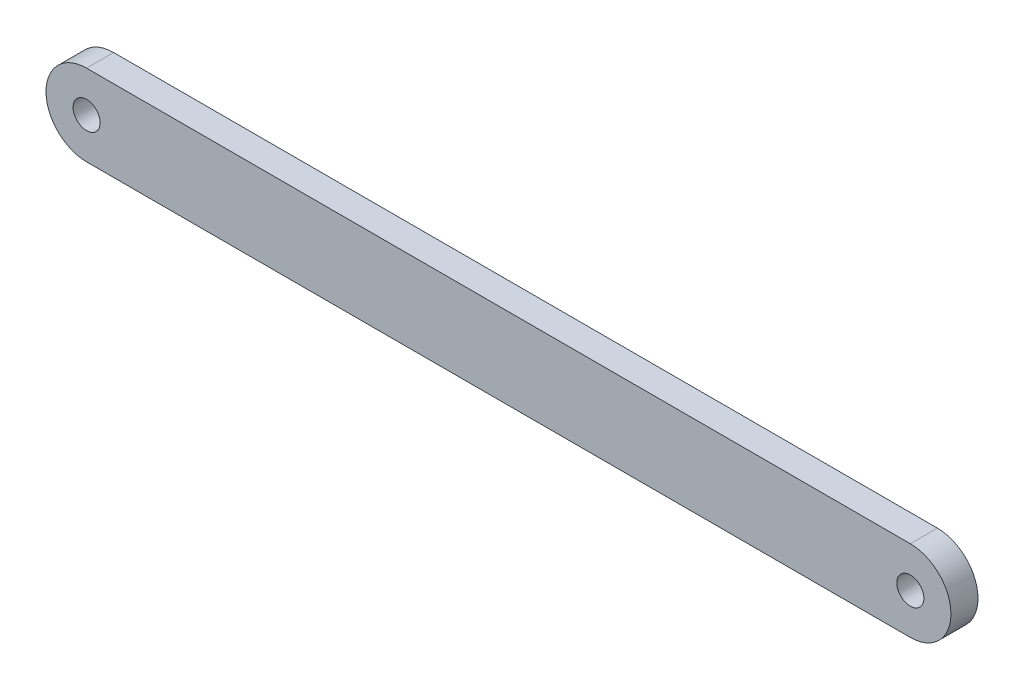
ISO-10303-21;
HEADER;
FILE_DESCRIPTION(('STEP AP214'),'2;1');
FILE_NAME('part.step','',(''),(''),'','','');
FILE_SCHEMA(('AUTOMOTIVE_DESIGN { 1 0 10303 214 1 1 1 1 }'));
ENDSEC;
DATA;
#1=APPLICATION_CONTEXT('core data for automotive mechanical design processes');
#2=APPLICATION_PROTOCOL_DEFINITION('international standard','automotive_design',2000,#1);
#3=PRODUCT_CONTEXT('',#1,'mechanical');
#4=PRODUCT('Part','Part','',(#3));
#5=PRODUCT_RELATED_PRODUCT_CATEGORY('part','',(#4));
#6=PRODUCT_DEFINITION_FORMATION('','',#4);
#7=PRODUCT_DEFINITION_CONTEXT('part definition',#1,'design');
#8=PRODUCT_DEFINITION('design','',#6,#7);
#9=PRODUCT_DEFINITION_SHAPE('','',#8);
#10=(LENGTH_UNIT() NAMED_UNIT(*) SI_UNIT(.MILLI.,.METRE.));
#11=(NAMED_UNIT(*) PLANE_ANGLE_UNIT() SI_UNIT($,.RADIAN.));
#12=(NAMED_UNIT(*) SI_UNIT($,.STERADIAN.) SOLID_ANGLE_UNIT());
#13=UNCERTAINTY_MEASURE_WITH_UNIT(LENGTH_MEASURE(1.E-05),#10,'distance_accuracy_value','');
#14=(GEOMETRIC_REPRESENTATION_CONTEXT(3) GLOBAL_UNCERTAINTY_ASSIGNED_CONTEXT((#13)) GLOBAL_UNIT_ASSIGNED_CONTEXT((#10,
#11,#12)) REPRESENTATION_CONTEXT('',''));
#15=CARTESIAN_POINT('',(0.,0.,0.));
#16=DIRECTION('',(0.,0.,1.));
#17=DIRECTION('',(1.,0.,0.));
#18=AXIS2_PLACEMENT_3D('',#15,#16,#17);
#19=CARTESIAN_POINT('',(0.,0.,5.));
#20=DIRECTION('',(0.,0.,1.));
#21=DIRECTION('',(1.,0.,0.));
#22=AXIS2_PLACEMENT_3D('',#19,#20,#21);
#23=PLANE('',#22);
#24=CARTESIAN_POINT('',(0.,0.,5.));
#25=DIRECTION('',(0.,0.,1.));
#26=DIRECTION('',(1.,0.,0.));
#27=AXIS2_PLACEMENT_3D('',#24,#25,#26);
#28=CIRCLE('',#27,2.5);
#29=CARTESIAN_POINT('',(2.50000000000002,0.,5.));
#30=VERTEX_POINT('',#29);
#31=EDGE_CURVE('E103',#30,#30,#28,.T.);
#32=ORIENTED_EDGE('',*,*,#31,.F.);
#33=EDGE_LOOP('',(#32));
#34=FACE_BOUND('',#33,.T.);
#35=CARTESIAN_POINT('',(0.,0.,5.));
#36=DIRECTION('',(0.,0.,1.));
#37=DIRECTION('',(1.,0.,0.));
#38=AXIS2_PLACEMENT_3D('',#35,#36,#37);
#39=CIRCLE('',#38,7.5);
#40=CARTESIAN_POINT('',(0.,7.5,5.));
#41=VERTEX_POINT('',#40);
#42=CARTESIAN_POINT('',(0.,-7.5,5.));
#43=VERTEX_POINT('',#42);
#44=EDGE_CURVE('E88',#41,#43,#39,.T.);
#45=ORIENTED_EDGE('',*,*,#44,.T.);
#46=DIRECTION('',(1.,0.,0.));
#47=VECTOR('',#46,1.);
#48=CARTESIAN_POINT('',(0.,-7.5,5.));
#49=LINE('',#48,#47);
#50=CARTESIAN_POINT('',(152.204,-7.5,5.));
#51=VERTEX_POINT('',#50);
#52=EDGE_CURVE('E83',#43,#51,#49,.T.);
#53=ORIENTED_EDGE('',*,*,#52,.T.);
#54=CARTESIAN_POINT('',(152.204,0.,5.));
#55=DIRECTION('',(0.,0.,1.));
#56=DIRECTION('',(1.,0.,0.));
#57=AXIS2_PLACEMENT_3D('',#54,#55,#56);
#58=CIRCLE('',#57,7.5);
#59=CARTESIAN_POINT('',(152.204,7.5,5.));
#60=VERTEX_POINT('',#59);
#61=EDGE_CURVE('E86',#51,#60,#58,.T.);
#62=ORIENTED_EDGE('',*,*,#61,.T.);
#63=DIRECTION('',(-1.,0.,0.));
#64=VECTOR('',#63,1.);
#65=CARTESIAN_POINT('',(0.,7.5,5.));
#66=LINE('',#65,#64);
#67=EDGE_CURVE('E53',#60,#41,#66,.T.);
#68=ORIENTED_EDGE('',*,*,#67,.T.);
#69=EDGE_LOOP('',(#45,#53,#62,#68));
#70=FACE_BOUND('',#69,.T.);
#71=CARTESIAN_POINT('',(152.204,0.,5.));
#72=DIRECTION('',(0.,0.,1.));
#73=DIRECTION('',(1.,0.,0.));
#74=AXIS2_PLACEMENT_3D('',#71,#72,#73);
#75=CIRCLE('',#74,2.5);
#76=CARTESIAN_POINT('',(154.704,0.,5.));
#77=VERTEX_POINT('',#76);
#78=EDGE_CURVE('E118',#77,#77,#75,.T.);
#79=ORIENTED_EDGE('',*,*,#78,.F.);
#80=EDGE_LOOP('',(#79));
#81=FACE_BOUND('',#80,.T.);
#82=ADVANCED_FACE('F36',(#34,#70,#81),#23,.T.);
#83=CARTESIAN_POINT('',(0.,0.,0.));
#84=DIRECTION('',(0.,0.,1.));
#85=DIRECTION('',(1.,0.,0.));
#86=AXIS2_PLACEMENT_3D('',#83,#84,#85);
#87=PLANE('',#86);
#88=CARTESIAN_POINT('',(0.,0.,0.));
#89=DIRECTION('',(0.,0.,1.));
#90=DIRECTION('',(1.,0.,0.));
#91=AXIS2_PLACEMENT_3D('',#88,#89,#90);
#92=CIRCLE('',#91,7.5);
#93=CARTESIAN_POINT('',(0.,7.5,0.));
#94=VERTEX_POINT('',#93);
#95=CARTESIAN_POINT('',(0.,-7.5,0.));
#96=VERTEX_POINT('',#95);
#97=EDGE_CURVE('E100',#94,#96,#92,.T.);
#98=ORIENTED_EDGE('',*,*,#97,.F.);
#99=DIRECTION('',(-1.,0.,0.));
#100=VECTOR('',#99,1.);
#101=CARTESIAN_POINT('',(0.,7.5,0.));
#102=LINE('',#101,#100);
#103=CARTESIAN_POINT('',(152.204,7.5,0.));
#104=VERTEX_POINT('',#103);
#105=EDGE_CURVE('E76',#104,#94,#102,.T.);
#106=ORIENTED_EDGE('',*,*,#105,.F.);
#107=CARTESIAN_POINT('',(152.204,0.,0.));
#108=DIRECTION('',(0.,0.,1.));
#109=DIRECTION('',(1.,0.,0.));
#110=AXIS2_PLACEMENT_3D('',#107,#108,#109);
#111=CIRCLE('',#110,7.5);
#112=CARTESIAN_POINT('',(152.204,-7.5,0.));
#113=VERTEX_POINT('',#112);
#114=EDGE_CURVE('E70',#113,#104,#111,.T.);
#115=ORIENTED_EDGE('',*,*,#114,.F.);
#116=DIRECTION('',(1.,0.,0.));
#117=VECTOR('',#116,1.);
#118=CARTESIAN_POINT('',(0.,-7.5,0.));
#119=LINE('',#118,#117);
#120=EDGE_CURVE('E92',#96,#113,#119,.T.);
#121=ORIENTED_EDGE('',*,*,#120,.F.);
#122=EDGE_LOOP('',(#98,#106,#115,#121));
#123=FACE_BOUND('',#122,.T.);
#124=CARTESIAN_POINT('',(0.,0.,0.));
#125=DIRECTION('',(0.,0.,1.));
#126=DIRECTION('',(1.,0.,0.));
#127=AXIS2_PLACEMENT_3D('',#124,#125,#126);
#128=CIRCLE('',#127,2.5);
#129=CARTESIAN_POINT('',(2.50000000000002,0.,0.));
#130=VERTEX_POINT('',#129);
#131=EDGE_CURVE('E115',#130,#130,#128,.T.);
#132=ORIENTED_EDGE('',*,*,#131,.T.);
#133=EDGE_LOOP('',(#132));
#134=FACE_BOUND('',#133,.T.);
#135=CARTESIAN_POINT('',(152.204,0.,0.));
#136=DIRECTION('',(0.,0.,1.));
#137=DIRECTION('',(1.,0.,0.));
#138=AXIS2_PLACEMENT_3D('',#135,#136,#137);
#139=CIRCLE('',#138,2.5);
#140=CARTESIAN_POINT('',(154.704,0.,0.));
#141=VERTEX_POINT('',#140);
#142=EDGE_CURVE('E121',#141,#141,#139,.T.);
#143=ORIENTED_EDGE('',*,*,#142,.T.);
#144=EDGE_LOOP('',(#143));
#145=FACE_BOUND('',#144,.T.);
#146=ADVANCED_FACE('F111',(#123,#134,#145),#87,.F.);
#147=CARTESIAN_POINT('',(0.,0.,5.));
#148=DIRECTION('',(0.,0.,-1.));
#149=DIRECTION('',(-1.,0.,0.));
#150=AXIS2_PLACEMENT_3D('',#147,#148,#149);
#151=CYLINDRICAL_SURFACE('',#150,7.5);
#152=ORIENTED_EDGE('',*,*,#97,.T.);
#153=DIRECTION('',(0.,0.,-1.));
#154=VECTOR('',#153,1.);
#155=CARTESIAN_POINT('',(0.,-7.5,5.));
#156=LINE('',#155,#154);
#157=EDGE_CURVE('E11',#43,#96,#156,.T.);
#158=ORIENTED_EDGE('',*,*,#157,.F.);
#159=ORIENTED_EDGE('',*,*,#44,.F.);
#160=DIRECTION('',(0.,0.,-1.));
#161=VECTOR('',#160,1.);
#162=CARTESIAN_POINT('',(0.,7.5,5.));
#163=LINE('',#162,#161);
#164=EDGE_CURVE('E96',#41,#94,#163,.T.);
#165=ORIENTED_EDGE('',*,*,#164,.T.);
#166=EDGE_LOOP('',(#152,#158,#159,#165));
#167=FACE_BOUND('',#166,.T.);
#168=ADVANCED_FACE('F38',(#167),#151,.T.);
#169=CARTESIAN_POINT('',(0.,-7.5,5.));
#170=DIRECTION('',(0.,1.,0.));
#171=DIRECTION('',(0.,0.,1.));
#172=AXIS2_PLACEMENT_3D('',#169,#170,#171);
#173=PLANE('',#172);
#174=ORIENTED_EDGE('',*,*,#120,.T.);
#175=DIRECTION('',(0.,0.,-1.));
#176=VECTOR('',#175,1.);
#177=CARTESIAN_POINT('',(152.204,-7.5,5.));
#178=LINE('',#177,#176);
#179=EDGE_CURVE('E45',#51,#113,#178,.T.);
#180=ORIENTED_EDGE('',*,*,#179,.F.);
#181=ORIENTED_EDGE('',*,*,#52,.F.);
#182=ORIENTED_EDGE('',*,*,#157,.T.);
#183=EDGE_LOOP('',(#174,#180,#181,#182));
#184=FACE_BOUND('',#183,.T.);
#185=ADVANCED_FACE('F91',(#184),#173,.F.);
#186=CARTESIAN_POINT('',(152.204,0.,5.));
#187=DIRECTION('',(0.,0.,-1.));
#188=DIRECTION('',(-1.,0.,0.));
#189=AXIS2_PLACEMENT_3D('',#186,#187,#188);
#190=CYLINDRICAL_SURFACE('',#189,7.5);
#191=ORIENTED_EDGE('',*,*,#114,.T.);
#192=DIRECTION('',(0.,0.,-1.));
#193=VECTOR('',#192,1.);
#194=CARTESIAN_POINT('',(152.204,7.5,5.));
#195=LINE('',#194,#193);
#196=EDGE_CURVE('E93',#60,#104,#195,.T.);
#197=ORIENTED_EDGE('',*,*,#196,.F.);
#198=ORIENTED_EDGE('',*,*,#61,.F.);
#199=ORIENTED_EDGE('',*,*,#179,.T.);
#200=EDGE_LOOP('',(#191,#197,#198,#199));
#201=FACE_BOUND('',#200,.T.);
#202=ADVANCED_FACE('F94',(#201),#190,.T.);
#203=CARTESIAN_POINT('',(0.,7.5,5.));
#204=DIRECTION('',(0.,-1.,0.));
#205=DIRECTION('',(0.,0.,-1.));
#206=AXIS2_PLACEMENT_3D('',#203,#204,#205);
#207=PLANE('',#206);
#208=ORIENTED_EDGE('',*,*,#105,.T.);
#209=ORIENTED_EDGE('',*,*,#164,.F.);
#210=ORIENTED_EDGE('',*,*,#67,.F.);
#211=ORIENTED_EDGE('',*,*,#196,.T.);
#212=EDGE_LOOP('',(#208,#209,#210,#211));
#213=FACE_BOUND('',#212,.T.);
#214=ADVANCED_FACE('F108',(#213),#207,.F.);
#215=CARTESIAN_POINT('',(0.,0.,5.));
#216=DIRECTION('',(0.,0.,-1.));
#217=DIRECTION('',(-1.,0.,0.));
#218=AXIS2_PLACEMENT_3D('',#215,#216,#217);
#219=CYLINDRICAL_SURFACE('',#218,2.5);
#220=ORIENTED_EDGE('',*,*,#31,.T.);
#221=EDGE_LOOP('',(#220));
#222=FACE_BOUND('',#221,.T.);
#223=ORIENTED_EDGE('',*,*,#131,.F.);
#224=EDGE_LOOP('',(#223));
#225=FACE_BOUND('',#224,.T.);
#226=ADVANCED_FACE('F138',(#222,#225),#219,.F.);
#227=CARTESIAN_POINT('',(152.204,0.,5.));
#228=DIRECTION('',(0.,0.,-1.));
#229=DIRECTION('',(-1.,0.,0.));
#230=AXIS2_PLACEMENT_3D('',#227,#228,#229);
#231=CYLINDRICAL_SURFACE('',#230,2.5);
#232=ORIENTED_EDGE('',*,*,#78,.T.);
#233=EDGE_LOOP('',(#232));
#234=FACE_BOUND('',#233,.T.);
#235=ORIENTED_EDGE('',*,*,#142,.F.);
#236=EDGE_LOOP('',(#235));
#237=FACE_BOUND('',#236,.T.);
#238=ADVANCED_FACE('F127',(#234,#237),#231,.F.);
#239=CLOSED_SHELL('',(#82,#146,#168,#185,#202,#214,#226,#238));
#240=MANIFOLD_SOLID_BREP('B2',#239);
#241=ADVANCED_BREP_SHAPE_REPRESENTATION('',(#18,#240),#14);
#242=SHAPE_DEFINITION_REPRESENTATION(#9,#241);
ENDSEC;
END-ISO-10303-21;
